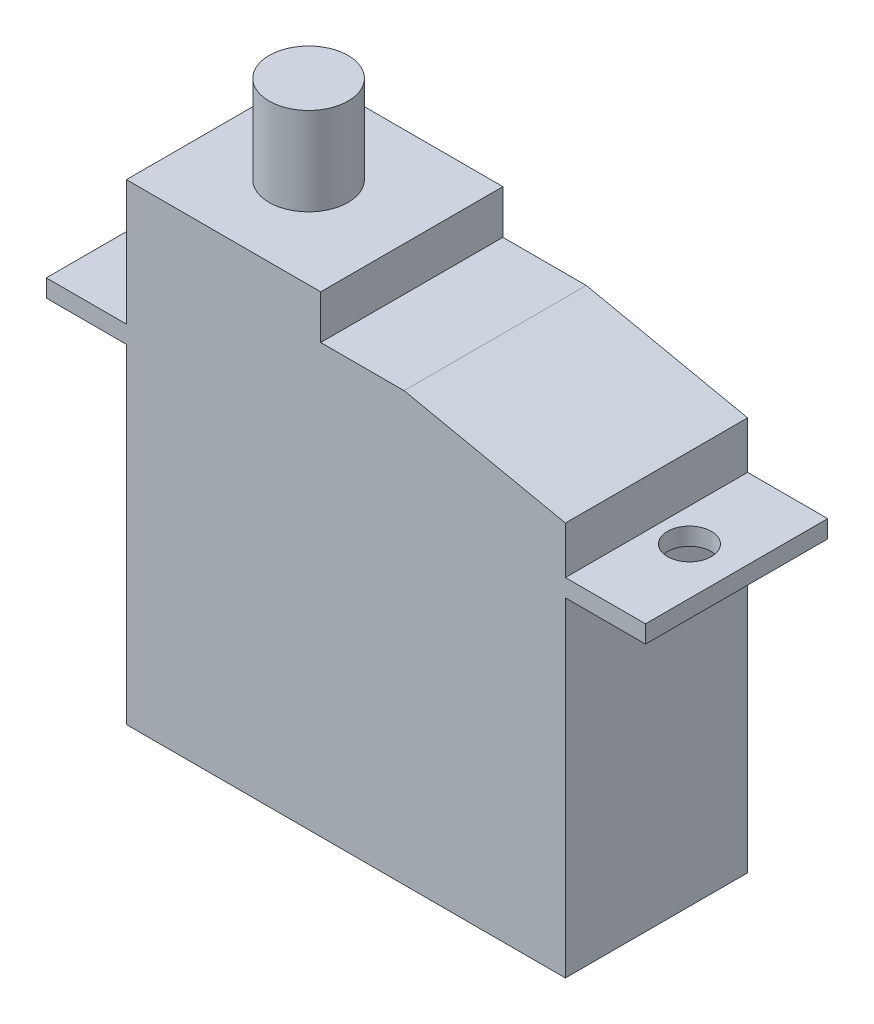
ISO-10303-21;
HEADER;
FILE_DESCRIPTION(('STEP AP214'),'2;1');
FILE_NAME('part.step','',(''),(''),'','','');
FILE_SCHEMA(('AUTOMOTIVE_DESIGN { 1 0 10303 214 1 1 1 1 }'));
ENDSEC;
DATA;
#1=APPLICATION_CONTEXT('core data for automotive mechanical design processes');
#2=APPLICATION_PROTOCOL_DEFINITION('international standard','automotive_design',2000,#1);
#3=PRODUCT_CONTEXT('',#1,'mechanical');
#4=PRODUCT('Part','Part','',(#3));
#5=PRODUCT_RELATED_PRODUCT_CATEGORY('part','',(#4));
#6=PRODUCT_DEFINITION_FORMATION('','',#4);
#7=PRODUCT_DEFINITION_CONTEXT('part definition',#1,'design');
#8=PRODUCT_DEFINITION('design','',#6,#7);
#9=PRODUCT_DEFINITION_SHAPE('','',#8);
#10=(LENGTH_UNIT() NAMED_UNIT(*) SI_UNIT(.MILLI.,.METRE.));
#11=(NAMED_UNIT(*) PLANE_ANGLE_UNIT() SI_UNIT($,.RADIAN.));
#12=(NAMED_UNIT(*) SI_UNIT($,.STERADIAN.) SOLID_ANGLE_UNIT());
#13=UNCERTAINTY_MEASURE_WITH_UNIT(LENGTH_MEASURE(1.E-05),#10,'distance_accuracy_value','');
#14=(GEOMETRIC_REPRESENTATION_CONTEXT(3) GLOBAL_UNCERTAINTY_ASSIGNED_CONTEXT((#13)) GLOBAL_UNIT_ASSIGNED_CONTEXT((#10,
#11,#12)) REPRESENTATION_CONTEXT('',''));
#15=CARTESIAN_POINT('',(0.,0.,0.));
#16=DIRECTION('',(0.,0.,1.));
#17=DIRECTION('',(1.,0.,0.));
#18=AXIS2_PLACEMENT_3D('',#15,#16,#17);
#19=CARTESIAN_POINT('',(20.,0.,4.15));
#20=DIRECTION('',(-1.,0.,0.));
#21=DIRECTION('',(0.,0.,1.));
#22=AXIS2_PLACEMENT_3D('',#19,#20,#21);
#23=PLANE('',#22);
#24=DIRECTION('',(0.,1.,0.));
#25=VECTOR('',#24,1.);
#26=CARTESIAN_POINT('',(20.,0.,4.15));
#27=LINE('',#26,#25);
#28=CARTESIAN_POINT('',(20.,15.8,4.15));
#29=VERTEX_POINT('',#28);
#30=CARTESIAN_POINT('',(20.,17.9509310160249,4.15));
#31=VERTEX_POINT('',#30);
#32=EDGE_CURVE('E220',#29,#31,#27,.T.);
#33=ORIENTED_EDGE('',*,*,#32,.F.);
#34=DIRECTION('',(0.,0.,-1.));
#35=VECTOR('',#34,1.);
#36=CARTESIAN_POINT('',(20.,15.8,4.15));
#37=LINE('',#36,#35);
#38=CARTESIAN_POINT('',(20.,15.8,-4.15));
#39=VERTEX_POINT('',#38);
#40=EDGE_CURVE('E210',#29,#39,#37,.T.);
#41=ORIENTED_EDGE('',*,*,#40,.T.);
#42=DIRECTION('',(0.,1.,0.));
#43=VECTOR('',#42,1.);
#44=CARTESIAN_POINT('',(20.,0.,-4.15));
#45=LINE('',#44,#43);
#46=CARTESIAN_POINT('',(20.,17.9509310160249,-4.15));
#47=VERTEX_POINT('',#46);
#48=EDGE_CURVE('E235',#39,#47,#45,.T.);
#49=ORIENTED_EDGE('',*,*,#48,.T.);
#50=DIRECTION('',(0.,0.,-1.));
#51=VECTOR('',#50,1.);
#52=CARTESIAN_POINT('',(20.,17.9509310160249,4.15));
#53=LINE('',#52,#51);
#54=EDGE_CURVE('E261',#31,#47,#53,.T.);
#55=ORIENTED_EDGE('',*,*,#54,.F.);
#56=EDGE_LOOP('',(#33,#41,#49,#55));
#57=FACE_BOUND('',#56,.T.);
#58=ADVANCED_FACE('F46',(#57),#23,.F.);
#59=CARTESIAN_POINT('',(0.,16.3363319803238,4.15));
#60=DIRECTION('',(1.,0.,0.));
#61=DIRECTION('',(0.,0.,-1.));
#62=AXIS2_PLACEMENT_3D('',#59,#60,#61);
#63=PLANE('',#62);
#64=DIRECTION('',(0.,-1.,0.));
#65=VECTOR('',#64,1.);
#66=CARTESIAN_POINT('',(0.,16.3363319803238,-4.15));
#67=LINE('',#66,#65);
#68=CARTESIAN_POINT('',(0.,21.5,-4.15));
#69=VERTEX_POINT('',#68);
#70=CARTESIAN_POINT('',(0.,15.8,-4.15));
#71=VERTEX_POINT('',#70);
#72=EDGE_CURVE('E247',#69,#71,#67,.T.);
#73=ORIENTED_EDGE('',*,*,#72,.T.);
#74=DIRECTION('',(0.,0.,1.));
#75=VECTOR('',#74,1.);
#76=CARTESIAN_POINT('',(0.,15.8,4.15));
#77=LINE('',#76,#75);
#78=CARTESIAN_POINT('',(0.,15.8,4.15));
#79=VERTEX_POINT('',#78);
#80=EDGE_CURVE('E207',#71,#79,#77,.T.);
#81=ORIENTED_EDGE('',*,*,#80,.T.);
#82=DIRECTION('',(0.,-1.,0.));
#83=VECTOR('',#82,1.);
#84=CARTESIAN_POINT('',(0.,0.,4.15));
#85=LINE('',#84,#83);
#86=CARTESIAN_POINT('',(0.,21.5,4.15));
#87=VERTEX_POINT('',#86);
#88=EDGE_CURVE('E214',#87,#79,#85,.T.);
#89=ORIENTED_EDGE('',*,*,#88,.F.);
#90=DIRECTION('',(0.,0.,-1.));
#91=VECTOR('',#90,1.);
#92=CARTESIAN_POINT('',(0.,21.5,4.15));
#93=LINE('',#92,#91);
#94=EDGE_CURVE('E233',#87,#69,#93,.T.);
#95=ORIENTED_EDGE('',*,*,#94,.T.);
#96=EDGE_LOOP('',(#73,#81,#89,#95));
#97=FACE_BOUND('',#96,.T.);
#98=ADVANCED_FACE('F315',(#97),#63,.F.);
#99=CARTESIAN_POINT('',(0.,0.,4.15));
#100=DIRECTION('',(0.,1.,0.));
#101=DIRECTION('',(0.,0.,1.));
#102=AXIS2_PLACEMENT_3D('',#99,#100,#101);
#103=PLANE('',#102);
#104=DIRECTION('',(1.,0.,0.));
#105=VECTOR('',#104,1.);
#106=CARTESIAN_POINT('',(0.,0.,-4.15));
#107=LINE('',#106,#105);
#108=CARTESIAN_POINT('',(0.,0.,-4.15));
#109=VERTEX_POINT('',#108);
#110=CARTESIAN_POINT('',(20.,0.,-4.15));
#111=VERTEX_POINT('',#110);
#112=EDGE_CURVE('E213',#109,#111,#107,.T.);
#113=ORIENTED_EDGE('',*,*,#112,.T.);
#114=DIRECTION('',(0.,0.,-1.));
#115=VECTOR('',#114,1.);
#116=CARTESIAN_POINT('',(20.,0.,4.15));
#117=LINE('',#116,#115);
#118=CARTESIAN_POINT('',(20.,0.,4.15));
#119=VERTEX_POINT('',#118);
#120=EDGE_CURVE('E263',#119,#111,#117,.T.);
#121=ORIENTED_EDGE('',*,*,#120,.F.);
#122=DIRECTION('',(1.,0.,0.));
#123=VECTOR('',#122,1.);
#124=CARTESIAN_POINT('',(0.,0.,4.15));
#125=LINE('',#124,#123);
#126=CARTESIAN_POINT('',(0.,0.,4.15));
#127=VERTEX_POINT('',#126);
#128=EDGE_CURVE('E217',#127,#119,#125,.T.);
#129=ORIENTED_EDGE('',*,*,#128,.F.);
#130=DIRECTION('',(0.,0.,-1.));
#131=VECTOR('',#130,1.);
#132=CARTESIAN_POINT('',(0.,0.,4.15));
#133=LINE('',#132,#131);
#134=EDGE_CURVE('E50',#127,#109,#133,.T.);
#135=ORIENTED_EDGE('',*,*,#134,.T.);
#136=EDGE_LOOP('',(#113,#121,#129,#135));
#137=FACE_BOUND('',#136,.T.);
#138=ADVANCED_FACE('F48',(#137),#103,.F.);
#139=CARTESIAN_POINT('',(20.,15.,-4.15));
#140=VERTEX_POINT('',#139);
#141=EDGE_CURVE('E236',#111,#140,#45,.T.);
#142=ORIENTED_EDGE('',*,*,#141,.T.);
#143=DIRECTION('',(0.,0.,1.));
#144=VECTOR('',#143,1.);
#145=CARTESIAN_POINT('',(20.,15.,4.15));
#146=LINE('',#145,#144);
#147=CARTESIAN_POINT('',(20.,15.,4.15));
#148=VERTEX_POINT('',#147);
#149=EDGE_CURVE('E204',#140,#148,#146,.T.);
#150=ORIENTED_EDGE('',*,*,#149,.T.);
#151=EDGE_CURVE('E221',#119,#148,#27,.T.);
#152=ORIENTED_EDGE('',*,*,#151,.F.);
#153=ORIENTED_EDGE('',*,*,#120,.T.);
#154=EDGE_LOOP('',(#142,#150,#152,#153));
#155=FACE_BOUND('',#154,.T.);
#156=ADVANCED_FACE('F278',(#155),#23,.F.);
#157=CARTESIAN_POINT('',(12.64967200472,19.5,4.15));
#158=DIRECTION('',(-0.206218452146479,-0.978505978517408,0.));
#159=DIRECTION('',(0.978505978517408,-0.206218452146479,0.));
#160=AXIS2_PLACEMENT_3D('',#157,#158,#159);
#161=PLANE('',#160);
#162=DIRECTION('',(-0.978505978517408,0.206218452146479,0.));
#163=VECTOR('',#162,1.);
#164=CARTESIAN_POINT('',(12.64967200472,19.5,-4.15));
#165=LINE('',#164,#163);
#166=CARTESIAN_POINT('',(12.64967200472,19.5,-4.15));
#167=VERTEX_POINT('',#166);
#168=EDGE_CURVE('E239',#47,#167,#165,.T.);
#169=ORIENTED_EDGE('',*,*,#168,.T.);
#170=DIRECTION('',(0.,0.,-1.));
#171=VECTOR('',#170,1.);
#172=CARTESIAN_POINT('',(12.64967200472,19.5,4.15));
#173=LINE('',#172,#171);
#174=CARTESIAN_POINT('',(12.64967200472,19.5,4.15));
#175=VERTEX_POINT('',#174);
#176=EDGE_CURVE('E258',#175,#167,#173,.T.);
#177=ORIENTED_EDGE('',*,*,#176,.F.);
#178=DIRECTION('',(-0.978505978517408,0.206218452146479,0.));
#179=VECTOR('',#178,1.);
#180=CARTESIAN_POINT('',(12.64967200472,19.5,4.15));
#181=LINE('',#180,#179);
#182=EDGE_CURVE('E224',#31,#175,#181,.T.);
#183=ORIENTED_EDGE('',*,*,#182,.F.);
#184=ORIENTED_EDGE('',*,*,#54,.T.);
#185=EDGE_LOOP('',(#169,#177,#183,#184));
#186=FACE_BOUND('',#185,.T.);
#187=ADVANCED_FACE('F298',(#186),#161,.F.);
#188=CARTESIAN_POINT('',(8.85227723255815,19.5,4.15));
#189=DIRECTION('',(0.,-1.,0.));
#190=DIRECTION('',(0.,0.,-1.));
#191=AXIS2_PLACEMENT_3D('',#188,#189,#190);
#192=PLANE('',#191);
#193=DIRECTION('',(-1.,0.,0.));
#194=VECTOR('',#193,1.);
#195=CARTESIAN_POINT('',(8.85227723255815,19.5,-4.15));
#196=LINE('',#195,#194);
#197=CARTESIAN_POINT('',(8.85227723255815,19.5,-4.15));
#198=VERTEX_POINT('',#197);
#199=EDGE_CURVE('E241',#167,#198,#196,.T.);
#200=ORIENTED_EDGE('',*,*,#199,.T.);
#201=DIRECTION('',(0.,0.,-1.));
#202=VECTOR('',#201,1.);
#203=CARTESIAN_POINT('',(8.85227723255815,19.5,4.15));
#204=LINE('',#203,#202);
#205=CARTESIAN_POINT('',(8.85227723255815,19.5,4.15));
#206=VERTEX_POINT('',#205);
#207=EDGE_CURVE('E255',#206,#198,#204,.T.);
#208=ORIENTED_EDGE('',*,*,#207,.F.);
#209=DIRECTION('',(-1.,0.,0.));
#210=VECTOR('',#209,1.);
#211=CARTESIAN_POINT('',(8.85227723255815,19.5,4.15));
#212=LINE('',#211,#210);
#213=EDGE_CURVE('E226',#175,#206,#212,.T.);
#214=ORIENTED_EDGE('',*,*,#213,.F.);
#215=ORIENTED_EDGE('',*,*,#176,.T.);
#216=EDGE_LOOP('',(#200,#208,#214,#215));
#217=FACE_BOUND('',#216,.T.);
#218=ADVANCED_FACE('F302',(#217),#192,.F.);
#219=CARTESIAN_POINT('',(8.85227723255815,19.5,4.15));
#220=DIRECTION('',(-1.,0.,0.));
#221=DIRECTION('',(0.,0.,1.));
#222=AXIS2_PLACEMENT_3D('',#219,#220,#221);
#223=PLANE('',#222);
#224=DIRECTION('',(0.,1.,0.));
#225=VECTOR('',#224,1.);
#226=CARTESIAN_POINT('',(8.85227723255815,19.5,-4.15));
#227=LINE('',#226,#225);
#228=CARTESIAN_POINT('',(8.85227723255815,21.5,-4.15));
#229=VERTEX_POINT('',#228);
#230=EDGE_CURVE('E243',#198,#229,#227,.T.);
#231=ORIENTED_EDGE('',*,*,#230,.T.);
#232=DIRECTION('',(0.,0.,-1.));
#233=VECTOR('',#232,1.);
#234=CARTESIAN_POINT('',(8.85227723255815,21.5,4.15));
#235=LINE('',#234,#233);
#236=CARTESIAN_POINT('',(8.85227723255815,21.5,4.15));
#237=VERTEX_POINT('',#236);
#238=EDGE_CURVE('E252',#237,#229,#235,.T.);
#239=ORIENTED_EDGE('',*,*,#238,.F.);
#240=DIRECTION('',(0.,1.,0.));
#241=VECTOR('',#240,1.);
#242=CARTESIAN_POINT('',(8.85227723255815,19.5,4.15));
#243=LINE('',#242,#241);
#244=EDGE_CURVE('E228',#206,#237,#243,.T.);
#245=ORIENTED_EDGE('',*,*,#244,.F.);
#246=ORIENTED_EDGE('',*,*,#207,.T.);
#247=EDGE_LOOP('',(#231,#239,#245,#246));
#248=FACE_BOUND('',#247,.T.);
#249=ADVANCED_FACE('F307',(#248),#223,.F.);
#250=CARTESIAN_POINT('',(0.,21.5,4.15));
#251=DIRECTION('',(0.,-1.,0.));
#252=DIRECTION('',(0.,0.,-1.));
#253=AXIS2_PLACEMENT_3D('',#250,#251,#252);
#254=PLANE('',#253);
#255=CARTESIAN_POINT('',(4.15,21.5,0.));
#256=DIRECTION('',(0.,1.,0.));
#257=DIRECTION('',(0.,0.,1.));
#258=AXIS2_PLACEMENT_3D('',#255,#256,#257);
#259=CIRCLE('',#258,1.8);
#260=CARTESIAN_POINT('',(4.15,21.5,1.8));
#261=VERTEX_POINT('',#260);
#262=EDGE_CURVE('E13',#261,#261,#259,.T.);
#263=ORIENTED_EDGE('',*,*,#262,.F.);
#264=EDGE_LOOP('',(#263));
#265=FACE_BOUND('',#264,.T.);
#266=DIRECTION('',(-1.,0.,0.));
#267=VECTOR('',#266,1.);
#268=CARTESIAN_POINT('',(0.,21.5,-4.15));
#269=LINE('',#268,#267);
#270=EDGE_CURVE('E245',#229,#69,#269,.T.);
#271=ORIENTED_EDGE('',*,*,#270,.T.);
#272=ORIENTED_EDGE('',*,*,#94,.F.);
#273=DIRECTION('',(-1.,0.,0.));
#274=VECTOR('',#273,1.);
#275=CARTESIAN_POINT('',(0.,21.5,4.15));
#276=LINE('',#275,#274);
#277=EDGE_CURVE('E230',#237,#87,#276,.T.);
#278=ORIENTED_EDGE('',*,*,#277,.F.);
#279=ORIENTED_EDGE('',*,*,#238,.T.);
#280=EDGE_LOOP('',(#271,#272,#278,#279));
#281=FACE_BOUND('',#280,.T.);
#282=ADVANCED_FACE('F311',(#265,#281),#254,.F.);
#283=CARTESIAN_POINT('',(0.,15.,4.15));
#284=VERTEX_POINT('',#283);
#285=EDGE_CURVE('E218',#284,#127,#85,.T.);
#286=ORIENTED_EDGE('',*,*,#285,.F.);
#287=DIRECTION('',(0.,0.,-1.));
#288=VECTOR('',#287,1.);
#289=CARTESIAN_POINT('',(0.,15.,4.15));
#290=LINE('',#289,#288);
#291=CARTESIAN_POINT('',(0.,15.,-4.15));
#292=VERTEX_POINT('',#291);
#293=EDGE_CURVE('E198',#284,#292,#290,.T.);
#294=ORIENTED_EDGE('',*,*,#293,.T.);
#295=EDGE_CURVE('E171',#292,#109,#67,.T.);
#296=ORIENTED_EDGE('',*,*,#295,.T.);
#297=ORIENTED_EDGE('',*,*,#134,.F.);
#298=EDGE_LOOP('',(#286,#294,#296,#297));
#299=FACE_BOUND('',#298,.T.);
#300=ADVANCED_FACE('F275',(#299),#63,.F.);
#301=CARTESIAN_POINT('',(0.,0.,4.15));
#302=DIRECTION('',(0.,0.,-1.));
#303=DIRECTION('',(-1.,0.,0.));
#304=AXIS2_PLACEMENT_3D('',#301,#302,#303);
#305=PLANE('',#304);
#306=ORIENTED_EDGE('',*,*,#151,.T.);
#307=DIRECTION('',(1.,0.,0.));
#308=VECTOR('',#307,1.);
#309=CARTESIAN_POINT('',(-3.65,15.,4.15));
#310=LINE('',#309,#308);
#311=CARTESIAN_POINT('',(23.65,15.,4.15));
#312=VERTEX_POINT('',#311);
#313=EDGE_CURVE('E192',#148,#312,#310,.T.);
#314=ORIENTED_EDGE('',*,*,#313,.T.);
#315=DIRECTION('',(0.,1.,0.));
#316=VECTOR('',#315,1.);
#317=CARTESIAN_POINT('',(23.65,15.,4.15));
#318=LINE('',#317,#316);
#319=CARTESIAN_POINT('',(23.65,15.8,4.15));
#320=VERTEX_POINT('',#319);
#321=EDGE_CURVE('E195',#312,#320,#318,.T.);
#322=ORIENTED_EDGE('',*,*,#321,.T.);
#323=DIRECTION('',(-1.,0.,0.));
#324=VECTOR('',#323,1.);
#325=CARTESIAN_POINT('',(-3.65,15.8,4.15));
#326=LINE('',#325,#324);
#327=EDGE_CURVE('E62',#320,#29,#326,.T.);
#328=ORIENTED_EDGE('',*,*,#327,.T.);
#329=ORIENTED_EDGE('',*,*,#32,.T.);
#330=ORIENTED_EDGE('',*,*,#182,.T.);
#331=ORIENTED_EDGE('',*,*,#213,.T.);
#332=ORIENTED_EDGE('',*,*,#244,.T.);
#333=ORIENTED_EDGE('',*,*,#277,.T.);
#334=ORIENTED_EDGE('',*,*,#88,.T.);
#335=CARTESIAN_POINT('',(-3.65,15.8,4.15));
#336=VERTEX_POINT('',#335);
#337=EDGE_CURVE('E180',#79,#336,#326,.T.);
#338=ORIENTED_EDGE('',*,*,#337,.T.);
#339=DIRECTION('',(0.,-1.,0.));
#340=VECTOR('',#339,1.);
#341=CARTESIAN_POINT('',(-3.65,15.,4.15));
#342=LINE('',#341,#340);
#343=CARTESIAN_POINT('',(-3.65,15.,4.15));
#344=VERTEX_POINT('',#343);
#345=EDGE_CURVE('E190',#336,#344,#342,.T.);
#346=ORIENTED_EDGE('',*,*,#345,.T.);
#347=EDGE_CURVE('E69',#344,#284,#310,.T.);
#348=ORIENTED_EDGE('',*,*,#347,.T.);
#349=ORIENTED_EDGE('',*,*,#285,.T.);
#350=ORIENTED_EDGE('',*,*,#128,.T.);
#351=EDGE_LOOP('',(#306,#314,#322,#328,#329,#330,#331,#332,#333,#334,#338,#346,#348,#349,#350));
#352=FACE_BOUND('',#351,.T.);
#353=ADVANCED_FACE('F280',(#352),#305,.F.);
#354=CARTESIAN_POINT('',(0.,0.,-4.15));
#355=DIRECTION('',(0.,0.,-1.));
#356=DIRECTION('',(-1.,0.,0.));
#357=AXIS2_PLACEMENT_3D('',#354,#355,#356);
#358=PLANE('',#357);
#359=ORIENTED_EDGE('',*,*,#295,.F.);
#360=DIRECTION('',(1.,0.,0.));
#361=VECTOR('',#360,1.);
#362=CARTESIAN_POINT('',(-3.65,15.,-4.15));
#363=LINE('',#362,#361);
#364=CARTESIAN_POINT('',(-3.65,15.,-4.15));
#365=VERTEX_POINT('',#364);
#366=EDGE_CURVE('E156',#365,#292,#363,.T.);
#367=ORIENTED_EDGE('',*,*,#366,.F.);
#368=DIRECTION('',(0.,-1.,0.));
#369=VECTOR('',#368,1.);
#370=CARTESIAN_POINT('',(-3.65,15.,-4.15));
#371=LINE('',#370,#369);
#372=CARTESIAN_POINT('',(-3.65,15.8,-4.15));
#373=VERTEX_POINT('',#372);
#374=EDGE_CURVE('E169',#373,#365,#371,.T.);
#375=ORIENTED_EDGE('',*,*,#374,.F.);
#376=DIRECTION('',(-1.,0.,0.));
#377=VECTOR('',#376,1.);
#378=CARTESIAN_POINT('',(-3.65,15.8,-4.15));
#379=LINE('',#378,#377);
#380=EDGE_CURVE('E188',#71,#373,#379,.T.);
#381=ORIENTED_EDGE('',*,*,#380,.F.);
#382=ORIENTED_EDGE('',*,*,#72,.F.);
#383=ORIENTED_EDGE('',*,*,#270,.F.);
#384=ORIENTED_EDGE('',*,*,#230,.F.);
#385=ORIENTED_EDGE('',*,*,#199,.F.);
#386=ORIENTED_EDGE('',*,*,#168,.F.);
#387=ORIENTED_EDGE('',*,*,#48,.F.);
#388=CARTESIAN_POINT('',(23.65,15.8,-4.15));
#389=VERTEX_POINT('',#388);
#390=EDGE_CURVE('E162',#389,#39,#379,.T.);
#391=ORIENTED_EDGE('',*,*,#390,.F.);
#392=DIRECTION('',(0.,1.,0.));
#393=VECTOR('',#392,1.);
#394=CARTESIAN_POINT('',(23.65,15.,-4.15));
#395=LINE('',#394,#393);
#396=CARTESIAN_POINT('',(23.65,15.,-4.15));
#397=VERTEX_POINT('',#396);
#398=EDGE_CURVE('E172',#397,#389,#395,.T.);
#399=ORIENTED_EDGE('',*,*,#398,.F.);
#400=EDGE_CURVE('E173',#140,#397,#363,.T.);
#401=ORIENTED_EDGE('',*,*,#400,.F.);
#402=ORIENTED_EDGE('',*,*,#141,.F.);
#403=ORIENTED_EDGE('',*,*,#112,.F.);
#404=EDGE_LOOP('',(#359,#367,#375,#381,#382,#383,#384,#385,#386,#387,#391,#399,#401,#402,#403));
#405=FACE_BOUND('',#404,.T.);
#406=ADVANCED_FACE('F167',(#405),#358,.T.);
#407=CARTESIAN_POINT('',(-3.65,15.,-4.15));
#408=DIRECTION('',(-1.,0.,0.));
#409=DIRECTION('',(0.,0.,1.));
#410=AXIS2_PLACEMENT_3D('',#407,#408,#409);
#411=PLANE('',#410);
#412=ORIENTED_EDGE('',*,*,#345,.F.);
#413=DIRECTION('',(0.,0.,1.));
#414=VECTOR('',#413,1.);
#415=CARTESIAN_POINT('',(-3.65,15.8,-4.15));
#416=LINE('',#415,#414);
#417=EDGE_CURVE('E178',#373,#336,#416,.T.);
#418=ORIENTED_EDGE('',*,*,#417,.F.);
#419=ORIENTED_EDGE('',*,*,#374,.T.);
#420=DIRECTION('',(0.,0.,1.));
#421=VECTOR('',#420,1.);
#422=CARTESIAN_POINT('',(-3.65,15.,-4.15));
#423=LINE('',#422,#421);
#424=EDGE_CURVE('E153',#365,#344,#423,.T.);
#425=ORIENTED_EDGE('',*,*,#424,.T.);
#426=EDGE_LOOP('',(#412,#418,#419,#425));
#427=FACE_BOUND('',#426,.T.);
#428=ADVANCED_FACE('F176',(#427),#411,.T.);
#429=CARTESIAN_POINT('',(-3.65,15.,-4.15));
#430=DIRECTION('',(0.,-1.,0.));
#431=DIRECTION('',(0.,0.,-1.));
#432=AXIS2_PLACEMENT_3D('',#429,#430,#431);
#433=PLANE('',#432);
#434=CARTESIAN_POINT('',(-1.5,15.,0.));
#435=DIRECTION('',(0.,-1.,0.));
#436=DIRECTION('',(0.,0.,-1.));
#437=AXIS2_PLACEMENT_3D('',#434,#435,#436);
#438=CIRCLE('',#437,1.);
#439=CARTESIAN_POINT('',(-1.5,15.,-1.));
#440=VERTEX_POINT('',#439);
#441=EDGE_CURVE('E486',#440,#440,#438,.F.);
#442=ORIENTED_EDGE('',*,*,#441,.T.);
#443=EDGE_LOOP('',(#442));
#444=FACE_BOUND('',#443,.T.);
#445=ORIENTED_EDGE('',*,*,#293,.F.);
#446=ORIENTED_EDGE('',*,*,#347,.F.);
#447=ORIENTED_EDGE('',*,*,#424,.F.);
#448=ORIENTED_EDGE('',*,*,#366,.T.);
#449=EDGE_LOOP('',(#445,#446,#447,#448));
#450=FACE_BOUND('',#449,.T.);
#451=ADVANCED_FACE('F155',(#444,#450),#433,.T.);
#452=CARTESIAN_POINT('',(-3.65,15.8,-4.15));
#453=DIRECTION('',(0.,1.,0.));
#454=DIRECTION('',(-1.,0.,0.));
#455=AXIS2_PLACEMENT_3D('',#452,#453,#454);
#456=PLANE('',#455);
#457=CARTESIAN_POINT('',(-1.5,15.8,0.));
#458=DIRECTION('',(0.,1.,0.));
#459=DIRECTION('',(-1.,0.,0.));
#460=AXIS2_PLACEMENT_3D('',#457,#458,#459);
#461=CIRCLE('',#460,1.);
#462=CARTESIAN_POINT('',(-2.5,15.8,0.));
#463=VERTEX_POINT('',#462);
#464=EDGE_CURVE('E193',#463,#463,#461,.T.);
#465=ORIENTED_EDGE('',*,*,#464,.F.);
#466=EDGE_LOOP('',(#465));
#467=FACE_BOUND('',#466,.T.);
#468=ORIENTED_EDGE('',*,*,#80,.F.);
#469=ORIENTED_EDGE('',*,*,#380,.T.);
#470=ORIENTED_EDGE('',*,*,#417,.T.);
#471=ORIENTED_EDGE('',*,*,#337,.F.);
#472=EDGE_LOOP('',(#468,#469,#470,#471));
#473=FACE_BOUND('',#472,.T.);
#474=ADVANCED_FACE('F317',(#467,#473),#456,.T.);
#475=CARTESIAN_POINT('',(21.5,15.8,0.));
#476=DIRECTION('',(0.,1.,0.));
#477=DIRECTION('',(-1.,0.,0.));
#478=AXIS2_PLACEMENT_3D('',#475,#476,#477);
#479=CIRCLE('',#478,1.);
#480=CARTESIAN_POINT('',(20.5,15.8,0.));
#481=VERTEX_POINT('',#480);
#482=EDGE_CURVE('E482',#481,#481,#479,.T.);
#483=ORIENTED_EDGE('',*,*,#482,.F.);
#484=EDGE_LOOP('',(#483));
#485=FACE_BOUND('',#484,.T.);
#486=ORIENTED_EDGE('',*,*,#40,.F.);
#487=ORIENTED_EDGE('',*,*,#327,.F.);
#488=DIRECTION('',(0.,0.,1.));
#489=VECTOR('',#488,1.);
#490=CARTESIAN_POINT('',(23.65,15.8,-4.15));
#491=LINE('',#490,#489);
#492=EDGE_CURVE('E199',#389,#320,#491,.T.);
#493=ORIENTED_EDGE('',*,*,#492,.F.);
#494=ORIENTED_EDGE('',*,*,#390,.T.);
#495=EDGE_LOOP('',(#486,#487,#493,#494));
#496=FACE_BOUND('',#495,.T.);
#497=ADVANCED_FACE('F288',(#485,#496),#456,.T.);
#498=CARTESIAN_POINT('',(21.5,15.,0.));
#499=DIRECTION('',(0.,-1.,0.));
#500=DIRECTION('',(0.,0.,-1.));
#501=AXIS2_PLACEMENT_3D('',#498,#499,#500);
#502=CIRCLE('',#501,1.);
#503=CARTESIAN_POINT('',(21.5,15.,-1.));
#504=VERTEX_POINT('',#503);
#505=EDGE_CURVE('E183',#504,#504,#502,.F.);
#506=ORIENTED_EDGE('',*,*,#505,.T.);
#507=EDGE_LOOP('',(#506));
#508=FACE_BOUND('',#507,.T.);
#509=ORIENTED_EDGE('',*,*,#149,.F.);
#510=ORIENTED_EDGE('',*,*,#400,.T.);
#511=DIRECTION('',(0.,0.,1.));
#512=VECTOR('',#511,1.);
#513=CARTESIAN_POINT('',(23.65,15.,-4.15));
#514=LINE('',#513,#512);
#515=EDGE_CURVE('E161',#397,#312,#514,.T.);
#516=ORIENTED_EDGE('',*,*,#515,.T.);
#517=ORIENTED_EDGE('',*,*,#313,.F.);
#518=EDGE_LOOP('',(#509,#510,#516,#517));
#519=FACE_BOUND('',#518,.T.);
#520=ADVANCED_FACE('F283',(#508,#519),#433,.T.);
#521=CARTESIAN_POINT('',(23.65,15.,-4.15));
#522=DIRECTION('',(1.,0.,0.));
#523=DIRECTION('',(0.,0.,-1.));
#524=AXIS2_PLACEMENT_3D('',#521,#522,#523);
#525=PLANE('',#524);
#526=ORIENTED_EDGE('',*,*,#321,.F.);
#527=ORIENTED_EDGE('',*,*,#515,.F.);
#528=ORIENTED_EDGE('',*,*,#398,.T.);
#529=ORIENTED_EDGE('',*,*,#492,.T.);
#530=EDGE_LOOP('',(#526,#527,#528,#529));
#531=FACE_BOUND('',#530,.T.);
#532=ADVANCED_FACE('F285',(#531),#525,.T.);
#533=CARTESIAN_POINT('',(21.5,-0.00100000000000447,0.));
#534=DIRECTION('',(0.,1.,0.));
#535=DIRECTION('',(-1.,0.,0.));
#536=AXIS2_PLACEMENT_3D('',#533,#534,#535);
#537=CYLINDRICAL_SURFACE('',#536,1.);
#538=ORIENTED_EDGE('',*,*,#505,.F.);
#539=EDGE_LOOP('',(#538));
#540=FACE_BOUND('',#539,.T.);
#541=ORIENTED_EDGE('',*,*,#482,.T.);
#542=EDGE_LOOP('',(#541));
#543=FACE_BOUND('',#542,.T.);
#544=ADVANCED_FACE('F403',(#540,#543),#537,.F.);
#545=CARTESIAN_POINT('',(-1.5,-0.001000000000001,0.));
#546=DIRECTION('',(0.,1.,0.));
#547=DIRECTION('',(-1.,0.,0.));
#548=AXIS2_PLACEMENT_3D('',#545,#546,#547);
#549=CYLINDRICAL_SURFACE('',#548,1.);
#550=ORIENTED_EDGE('',*,*,#441,.F.);
#551=EDGE_LOOP('',(#550));
#552=FACE_BOUND('',#551,.T.);
#553=ORIENTED_EDGE('',*,*,#464,.T.);
#554=EDGE_LOOP('',(#553));
#555=FACE_BOUND('',#554,.T.);
#556=ADVANCED_FACE('F434',(#552,#555),#549,.F.);
#557=CARTESIAN_POINT('',(4.15,25.5,0.));
#558=DIRECTION('',(0.,-1.,0.));
#559=DIRECTION('',(0.,0.,-1.));
#560=AXIS2_PLACEMENT_3D('',#557,#558,#559);
#561=CYLINDRICAL_SURFACE('',#560,1.8);
#562=CARTESIAN_POINT('',(4.15,25.5,0.));
#563=DIRECTION('',(0.,1.,0.));
#564=DIRECTION('',(0.,0.,1.));
#565=AXIS2_PLACEMENT_3D('',#562,#563,#564);
#566=CIRCLE('',#565,1.8);
#567=CARTESIAN_POINT('',(4.15,25.5,1.8));
#568=VERTEX_POINT('',#567);
#569=EDGE_CURVE('E479',#568,#568,#566,.T.);
#570=ORIENTED_EDGE('',*,*,#569,.F.);
#571=EDGE_LOOP('',(#570));
#572=FACE_BOUND('',#571,.T.);
#573=ORIENTED_EDGE('',*,*,#262,.T.);
#574=EDGE_LOOP('',(#573));
#575=FACE_BOUND('',#574,.T.);
#576=ADVANCED_FACE('F443',(#572,#575),#561,.T.);
#577=CARTESIAN_POINT('',(4.15,25.5,0.));
#578=DIRECTION('',(0.,1.,0.));
#579=DIRECTION('',(0.,0.,1.));
#580=AXIS2_PLACEMENT_3D('',#577,#578,#579);
#581=PLANE('',#580);
#582=ORIENTED_EDGE('',*,*,#569,.T.);
#583=EDGE_LOOP('',(#582));
#584=FACE_BOUND('',#583,.T.);
#585=ADVANCED_FACE('F463',(#584),#581,.T.);
#586=CLOSED_SHELL('',(#58,#98,#138,#156,#187,#218,#249,#282,#300,#353,#406,#428,#451,#474,#497,
#520,#532,#544,#556,#576,#585));
#587=MANIFOLD_SOLID_BREP('B2',#586);
#588=ADVANCED_BREP_SHAPE_REPRESENTATION('',(#18,#587),#14);
#589=SHAPE_DEFINITION_REPRESENTATION(#9,#588);
ENDSEC;
END-ISO-10303-21;
